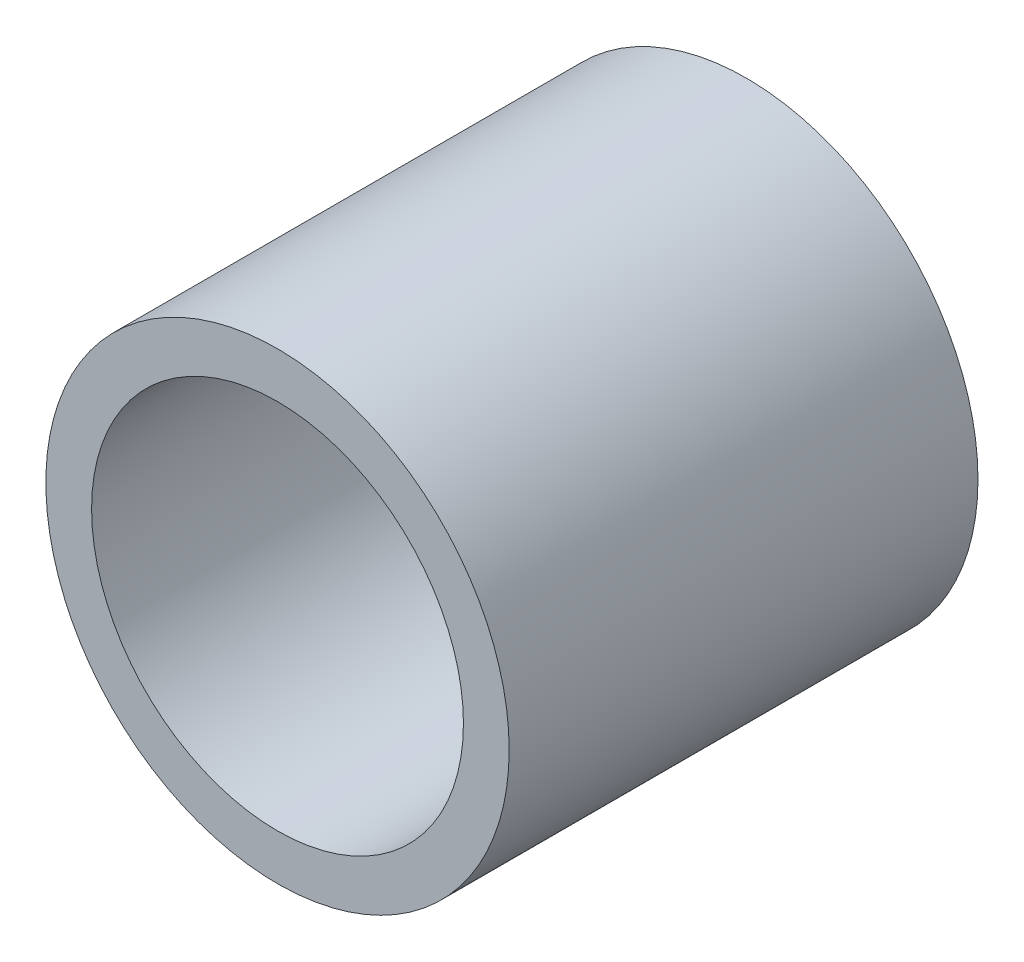
ISO-10303-21;
HEADER;
FILE_DESCRIPTION(('STEP AP214'),'2;1');
FILE_NAME('part.step','',(''),(''),'','','');
FILE_SCHEMA(('AUTOMOTIVE_DESIGN { 1 0 10303 214 1 1 1 1 }'));
ENDSEC;
DATA;
#1=APPLICATION_CONTEXT('core data for automotive mechanical design processes');
#2=APPLICATION_PROTOCOL_DEFINITION('international standard','automotive_design',2000,#1);
#3=PRODUCT_CONTEXT('',#1,'mechanical');
#4=PRODUCT('Part','Part','',(#3));
#5=PRODUCT_RELATED_PRODUCT_CATEGORY('part','',(#4));
#6=PRODUCT_DEFINITION_FORMATION('','',#4);
#7=PRODUCT_DEFINITION_CONTEXT('part definition',#1,'design');
#8=PRODUCT_DEFINITION('design','',#6,#7);
#9=PRODUCT_DEFINITION_SHAPE('','',#8);
#10=(LENGTH_UNIT() NAMED_UNIT(*) SI_UNIT(.MILLI.,.METRE.));
#11=(NAMED_UNIT(*) PLANE_ANGLE_UNIT() SI_UNIT($,.RADIAN.));
#12=(NAMED_UNIT(*) SI_UNIT($,.STERADIAN.) SOLID_ANGLE_UNIT());
#13=UNCERTAINTY_MEASURE_WITH_UNIT(LENGTH_MEASURE(1.E-05),#10,'distance_accuracy_value','');
#14=(GEOMETRIC_REPRESENTATION_CONTEXT(3) GLOBAL_UNCERTAINTY_ASSIGNED_CONTEXT((#13)) GLOBAL_UNIT_ASSIGNED_CONTEXT((#10,
#11,#12)) REPRESENTATION_CONTEXT('',''));
#15=CARTESIAN_POINT('',(0.,0.,0.));
#16=DIRECTION('',(0.,0.,1.));
#17=DIRECTION('',(1.,0.,0.));
#18=AXIS2_PLACEMENT_3D('',#15,#16,#17);
#19=CARTESIAN_POINT('',(0.,0.,10.25));
#20=DIRECTION('',(0.,0.,1.));
#21=DIRECTION('',(1.,0.,0.));
#22=AXIS2_PLACEMENT_3D('',#19,#20,#21);
#23=PLANE('',#22);
#24=CARTESIAN_POINT('',(0.,0.,10.25));
#25=DIRECTION('',(0.,0.,1.));
#26=DIRECTION('',(1.,0.,0.));
#27=AXIS2_PLACEMENT_3D('',#24,#25,#26);
#28=CIRCLE('',#27,5.065);
#29=CARTESIAN_POINT('',(5.065,0.,10.25));
#30=VERTEX_POINT('',#29);
#31=EDGE_CURVE('E10',#30,#30,#28,.T.);
#32=ORIENTED_EDGE('',*,*,#31,.T.);
#33=EDGE_LOOP('',(#32));
#34=FACE_BOUND('',#33,.T.);
#35=CARTESIAN_POINT('',(0.,0.,10.25));
#36=DIRECTION('',(0.,0.,1.));
#37=DIRECTION('',(1.,0.,0.));
#38=AXIS2_PLACEMENT_3D('',#35,#36,#37);
#39=CIRCLE('',#38,4.065);
#40=CARTESIAN_POINT('',(4.065,0.,10.25));
#41=VERTEX_POINT('',#40);
#42=EDGE_CURVE('E42',#41,#41,#39,.T.);
#43=ORIENTED_EDGE('',*,*,#42,.F.);
#44=EDGE_LOOP('',(#43));
#45=FACE_BOUND('',#44,.T.);
#46=ADVANCED_FACE('F31',(#34,#45),#23,.T.);
#47=CARTESIAN_POINT('',(0.,0.,0.));
#48=DIRECTION('',(0.,0.,1.));
#49=DIRECTION('',(1.,0.,0.));
#50=AXIS2_PLACEMENT_3D('',#47,#48,#49);
#51=PLANE('',#50);
#52=CARTESIAN_POINT('',(0.,0.,0.));
#53=DIRECTION('',(0.,0.,1.));
#54=DIRECTION('',(1.,0.,0.));
#55=AXIS2_PLACEMENT_3D('',#52,#53,#54);
#56=CIRCLE('',#55,5.065);
#57=CARTESIAN_POINT('',(5.065,0.,0.));
#58=VERTEX_POINT('',#57);
#59=EDGE_CURVE('E35',#58,#58,#56,.T.);
#60=ORIENTED_EDGE('',*,*,#59,.F.);
#61=EDGE_LOOP('',(#60));
#62=FACE_BOUND('',#61,.T.);
#63=CARTESIAN_POINT('',(0.,0.,0.));
#64=DIRECTION('',(0.,0.,1.));
#65=DIRECTION('',(1.,0.,0.));
#66=AXIS2_PLACEMENT_3D('',#63,#64,#65);
#67=CIRCLE('',#66,4.065);
#68=CARTESIAN_POINT('',(4.065,0.,0.));
#69=VERTEX_POINT('',#68);
#70=EDGE_CURVE('E44',#69,#69,#67,.T.);
#71=ORIENTED_EDGE('',*,*,#70,.T.);
#72=EDGE_LOOP('',(#71));
#73=FACE_BOUND('',#72,.T.);
#74=ADVANCED_FACE('F54',(#62,#73),#51,.F.);
#75=CARTESIAN_POINT('',(0.,0.,10.25));
#76=DIRECTION('',(0.,0.,-1.));
#77=DIRECTION('',(-1.,0.,0.));
#78=AXIS2_PLACEMENT_3D('',#75,#76,#77);
#79=CYLINDRICAL_SURFACE('',#78,5.065);
#80=ORIENTED_EDGE('',*,*,#31,.F.);
#81=EDGE_LOOP('',(#80));
#82=FACE_BOUND('',#81,.T.);
#83=ORIENTED_EDGE('',*,*,#59,.T.);
#84=EDGE_LOOP('',(#83));
#85=FACE_BOUND('',#84,.T.);
#86=ADVANCED_FACE('F33',(#82,#85),#79,.T.);
#87=CARTESIAN_POINT('',(0.,0.,10.25));
#88=DIRECTION('',(0.,0.,-1.));
#89=DIRECTION('',(-1.,0.,0.));
#90=AXIS2_PLACEMENT_3D('',#87,#88,#89);
#91=CYLINDRICAL_SURFACE('',#90,4.065);
#92=ORIENTED_EDGE('',*,*,#42,.T.);
#93=EDGE_LOOP('',(#92));
#94=FACE_BOUND('',#93,.T.);
#95=ORIENTED_EDGE('',*,*,#70,.F.);
#96=EDGE_LOOP('',(#95));
#97=FACE_BOUND('',#96,.T.);
#98=ADVANCED_FACE('F50',(#94,#97),#91,.F.);
#99=CLOSED_SHELL('',(#46,#74,#86,#98));
#100=MANIFOLD_SOLID_BREP('B2',#99);
#101=ADVANCED_BREP_SHAPE_REPRESENTATION('',(#18,#100),#14);
#102=SHAPE_DEFINITION_REPRESENTATION(#9,#101);
ENDSEC;
END-ISO-10303-21;
